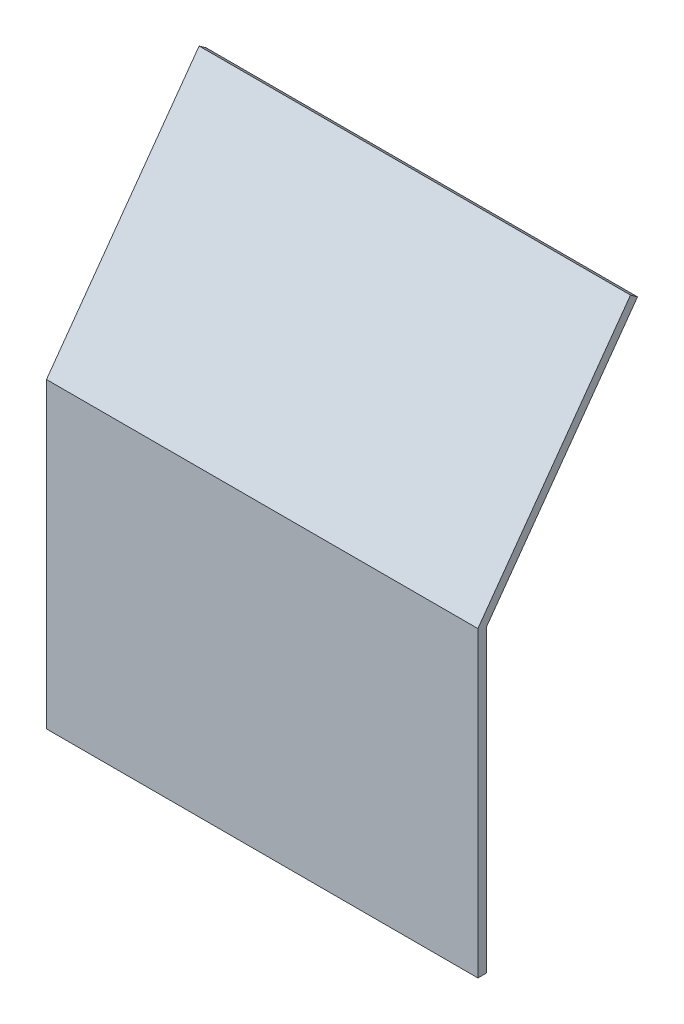
ISO-10303-21;
HEADER;
FILE_DESCRIPTION(('STEP AP214'),'2;1');
FILE_NAME('part.step','',(''),(''),'','','');
FILE_SCHEMA(('AUTOMOTIVE_DESIGN { 1 0 10303 214 1 1 1 1 }'));
ENDSEC;
DATA;
#1=APPLICATION_CONTEXT('core data for automotive mechanical design processes');
#2=APPLICATION_PROTOCOL_DEFINITION('international standard','automotive_design',2000,#1);
#3=PRODUCT_CONTEXT('',#1,'mechanical');
#4=PRODUCT('Part','Part','',(#3));
#5=PRODUCT_RELATED_PRODUCT_CATEGORY('part','',(#4));
#6=PRODUCT_DEFINITION_FORMATION('','',#4);
#7=PRODUCT_DEFINITION_CONTEXT('part definition',#1,'design');
#8=PRODUCT_DEFINITION('design','',#6,#7);
#9=PRODUCT_DEFINITION_SHAPE('','',#8);
#10=(LENGTH_UNIT() NAMED_UNIT(*) SI_UNIT(.MILLI.,.METRE.));
#11=(NAMED_UNIT(*) PLANE_ANGLE_UNIT() SI_UNIT($,.RADIAN.));
#12=(NAMED_UNIT(*) SI_UNIT($,.STERADIAN.) SOLID_ANGLE_UNIT());
#13=UNCERTAINTY_MEASURE_WITH_UNIT(LENGTH_MEASURE(1.E-05),#10,'distance_accuracy_value','');
#14=(GEOMETRIC_REPRESENTATION_CONTEXT(3) GLOBAL_UNCERTAINTY_ASSIGNED_CONTEXT((#13)) GLOBAL_UNIT_ASSIGNED_CONTEXT((#10,
#11,#12)) REPRESENTATION_CONTEXT('',''));
#15=CARTESIAN_POINT('',(0.,0.,0.));
#16=DIRECTION('',(0.,0.,1.));
#17=DIRECTION('',(1.,0.,0.));
#18=AXIS2_PLACEMENT_3D('',#15,#16,#17);
#19=CARTESIAN_POINT('',(100.,0.,0.));
#20=DIRECTION('',(0.,1.,0.));
#21=DIRECTION('',(0.,0.,1.));
#22=AXIS2_PLACEMENT_3D('',#19,#20,#21);
#23=PLANE('',#22);
#24=DIRECTION('',(0.,0.,-1.));
#25=VECTOR('',#24,1.);
#26=CARTESIAN_POINT('',(-100.,0.,0.));
#27=LINE('',#26,#25);
#28=CARTESIAN_POINT('',(-100.,0.,4.));
#29=VERTEX_POINT('',#28);
#30=CARTESIAN_POINT('',(-100.,0.,0.));
#31=VERTEX_POINT('',#30);
#32=EDGE_CURVE('E116',#29,#31,#27,.T.);
#33=ORIENTED_EDGE('',*,*,#32,.T.);
#34=DIRECTION('',(-1.,0.,0.));
#35=VECTOR('',#34,1.);
#36=CARTESIAN_POINT('',(100.,0.,0.));
#37=LINE('',#36,#35);
#38=CARTESIAN_POINT('',(100.,0.,0.));
#39=VERTEX_POINT('',#38);
#40=EDGE_CURVE('E11',#39,#31,#37,.T.);
#41=ORIENTED_EDGE('',*,*,#40,.F.);
#42=DIRECTION('',(0.,0.,-1.));
#43=VECTOR('',#42,1.);
#44=CARTESIAN_POINT('',(100.,0.,0.));
#45=LINE('',#44,#43);
#46=CARTESIAN_POINT('',(100.,0.,4.));
#47=VERTEX_POINT('',#46);
#48=EDGE_CURVE('E126',#47,#39,#45,.T.);
#49=ORIENTED_EDGE('',*,*,#48,.F.);
#50=DIRECTION('',(-1.,0.,0.));
#51=VECTOR('',#50,1.);
#52=CARTESIAN_POINT('',(100.,0.,4.));
#53=LINE('',#52,#51);
#54=EDGE_CURVE('E112',#47,#29,#53,.T.);
#55=ORIENTED_EDGE('',*,*,#54,.T.);
#56=EDGE_LOOP('',(#33,#41,#49,#55));
#57=FACE_BOUND('',#56,.T.);
#58=ADVANCED_FACE('F32',(#57),#23,.F.);
#59=CARTESIAN_POINT('',(100.,139.,0.));
#60=DIRECTION('',(0.,0.,1.));
#61=DIRECTION('',(0.,-1.,0.));
#62=AXIS2_PLACEMENT_3D('',#59,#60,#61);
#63=PLANE('',#62);
#64=DIRECTION('',(0.,1.,0.));
#65=VECTOR('',#64,1.);
#66=CARTESIAN_POINT('',(-100.,139.,0.));
#67=LINE('',#66,#65);
#68=CARTESIAN_POINT('',(-100.,139.,0.));
#69=VERTEX_POINT('',#68);
#70=EDGE_CURVE('E119',#31,#69,#67,.T.);
#71=ORIENTED_EDGE('',*,*,#70,.T.);
#72=DIRECTION('',(-1.,0.,0.));
#73=VECTOR('',#72,1.);
#74=CARTESIAN_POINT('',(100.,139.,0.));
#75=LINE('',#74,#73);
#76=CARTESIAN_POINT('',(100.,139.,0.));
#77=VERTEX_POINT('',#76);
#78=EDGE_CURVE('E40',#77,#69,#75,.T.);
#79=ORIENTED_EDGE('',*,*,#78,.F.);
#80=DIRECTION('',(0.,1.,0.));
#81=VECTOR('',#80,1.);
#82=CARTESIAN_POINT('',(100.,139.,0.));
#83=LINE('',#82,#81);
#84=EDGE_CURVE('E85',#39,#77,#83,.T.);
#85=ORIENTED_EDGE('',*,*,#84,.F.);
#86=ORIENTED_EDGE('',*,*,#40,.T.);
#87=EDGE_LOOP('',(#71,#79,#85,#86));
#88=FACE_BOUND('',#87,.T.);
#89=ADVANCED_FACE('F150',(#88),#63,.F.);
#90=CARTESIAN_POINT('',(100.,236.46794344809,-70.));
#91=DIRECTION('',(0.,0.583333333333333,0.812232862067414));
#92=DIRECTION('',(0.,-0.812232862067414,0.583333333333333));
#93=AXIS2_PLACEMENT_3D('',#90,#91,#92);
#94=PLANE('',#93);
#95=DIRECTION('',(0.,0.812232862067414,-0.583333333333334));
#96=VECTOR('',#95,1.);
#97=CARTESIAN_POINT('',(-100.,236.46794344809,-70.));
#98=LINE('',#97,#96);
#99=CARTESIAN_POINT('',(-100.,236.46794344809,-70.));
#100=VERTEX_POINT('',#99);
#101=EDGE_CURVE('E121',#69,#100,#98,.T.);
#102=ORIENTED_EDGE('',*,*,#101,.T.);
#103=DIRECTION('',(-1.,0.,0.));
#104=VECTOR('',#103,1.);
#105=CARTESIAN_POINT('',(100.,236.46794344809,-70.));
#106=LINE('',#105,#104);
#107=CARTESIAN_POINT('',(100.,236.46794344809,-70.));
#108=VERTEX_POINT('',#107);
#109=EDGE_CURVE('E107',#108,#100,#106,.T.);
#110=ORIENTED_EDGE('',*,*,#109,.F.);
#111=DIRECTION('',(0.,0.812232862067414,-0.583333333333334));
#112=VECTOR('',#111,1.);
#113=CARTESIAN_POINT('',(100.,236.46794344809,-70.));
#114=LINE('',#113,#112);
#115=EDGE_CURVE('E98',#77,#108,#114,.T.);
#116=ORIENTED_EDGE('',*,*,#115,.F.);
#117=ORIENTED_EDGE('',*,*,#78,.T.);
#118=EDGE_LOOP('',(#102,#110,#116,#117));
#119=FACE_BOUND('',#118,.T.);
#120=ADVANCED_FACE('F132',(#119),#94,.F.);
#121=CARTESIAN_POINT('',(100.,238.801276781423,-66.7510685517304));
#122=DIRECTION('',(0.,-0.812232862067415,0.583333333333332));
#123=DIRECTION('',(0.,-0.583333333333332,-0.812232862067415));
#124=AXIS2_PLACEMENT_3D('',#121,#122,#123);
#125=PLANE('',#124);
#126=DIRECTION('',(0.,0.583333333333332,0.812232862067415));
#127=VECTOR('',#126,1.);
#128=CARTESIAN_POINT('',(-100.,238.801276781423,-66.7510685517304));
#129=LINE('',#128,#127);
#130=CARTESIAN_POINT('',(-100.,238.801276781423,-66.7510685517304));
#131=VERTEX_POINT('',#130);
#132=EDGE_CURVE('E106',#100,#131,#129,.T.);
#133=ORIENTED_EDGE('',*,*,#132,.T.);
#134=DIRECTION('',(-1.,0.,0.));
#135=VECTOR('',#134,1.);
#136=CARTESIAN_POINT('',(100.,238.801276781423,-66.7510685517304));
#137=LINE('',#136,#135);
#138=CARTESIAN_POINT('',(100.,238.801276781423,-66.7510685517304));
#139=VERTEX_POINT('',#138);
#140=EDGE_CURVE('E103',#139,#131,#137,.T.);
#141=ORIENTED_EDGE('',*,*,#140,.F.);
#142=DIRECTION('',(0.,0.583333333333332,0.812232862067415));
#143=VECTOR('',#142,1.);
#144=CARTESIAN_POINT('',(100.,238.801276781423,-66.7510685517304));
#145=LINE('',#144,#143);
#146=EDGE_CURVE('E92',#108,#139,#145,.T.);
#147=ORIENTED_EDGE('',*,*,#146,.F.);
#148=ORIENTED_EDGE('',*,*,#109,.T.);
#149=EDGE_LOOP('',(#133,#141,#147,#148));
#150=FACE_BOUND('',#149,.T.);
#151=ADVANCED_FACE('F104',(#150),#125,.F.);
#152=CARTESIAN_POINT('',(100.,140.287546088681,3.99999999999999));
#153=DIRECTION('',(0.,-0.583333333333333,-0.812232862067414));
#154=DIRECTION('',(0.,0.812232862067414,-0.583333333333333));
#155=AXIS2_PLACEMENT_3D('',#152,#153,#154);
#156=PLANE('',#155);
#157=DIRECTION('',(0.,-0.812232862067414,0.583333333333333));
#158=VECTOR('',#157,1.);
#159=CARTESIAN_POINT('',(-100.,140.287546088681,3.99999999999999));
#160=LINE('',#159,#158);
#161=CARTESIAN_POINT('',(-100.,140.287546088681,3.99999999999999));
#162=VERTEX_POINT('',#161);
#163=EDGE_CURVE('E71',#131,#162,#160,.T.);
#164=ORIENTED_EDGE('',*,*,#163,.T.);
#165=DIRECTION('',(-1.,0.,0.));
#166=VECTOR('',#165,1.);
#167=CARTESIAN_POINT('',(100.,140.287546088681,3.99999999999999));
#168=LINE('',#167,#166);
#169=CARTESIAN_POINT('',(100.,140.287546088681,3.99999999999999));
#170=VERTEX_POINT('',#169);
#171=EDGE_CURVE('E108',#170,#162,#168,.T.);
#172=ORIENTED_EDGE('',*,*,#171,.F.);
#173=DIRECTION('',(0.,-0.812232862067414,0.583333333333333));
#174=VECTOR('',#173,1.);
#175=CARTESIAN_POINT('',(100.,140.287546088681,3.99999999999999));
#176=LINE('',#175,#174);
#177=EDGE_CURVE('E96',#139,#170,#176,.T.);
#178=ORIENTED_EDGE('',*,*,#177,.F.);
#179=ORIENTED_EDGE('',*,*,#140,.T.);
#180=EDGE_LOOP('',(#164,#172,#178,#179));
#181=FACE_BOUND('',#180,.T.);
#182=ADVANCED_FACE('F110',(#181),#156,.F.);
#183=CARTESIAN_POINT('',(100.,0.,4.));
#184=DIRECTION('',(0.,0.,-1.));
#185=DIRECTION('',(0.,1.,0.));
#186=AXIS2_PLACEMENT_3D('',#183,#184,#185);
#187=PLANE('',#186);
#188=DIRECTION('',(0.,-1.,0.));
#189=VECTOR('',#188,1.);
#190=CARTESIAN_POINT('',(-100.,0.,4.));
#191=LINE('',#190,#189);
#192=EDGE_CURVE('E77',#162,#29,#191,.T.);
#193=ORIENTED_EDGE('',*,*,#192,.T.);
#194=ORIENTED_EDGE('',*,*,#54,.F.);
#195=DIRECTION('',(0.,-1.,0.));
#196=VECTOR('',#195,1.);
#197=CARTESIAN_POINT('',(100.,0.,4.));
#198=LINE('',#197,#196);
#199=EDGE_CURVE('E48',#170,#47,#198,.T.);
#200=ORIENTED_EDGE('',*,*,#199,.F.);
#201=ORIENTED_EDGE('',*,*,#171,.T.);
#202=EDGE_LOOP('',(#193,#194,#200,#201));
#203=FACE_BOUND('',#202,.T.);
#204=ADVANCED_FACE('F139',(#203),#187,.F.);
#205=CARTESIAN_POINT('',(100.,0.,0.));
#206=DIRECTION('',(-1.,0.,0.));
#207=DIRECTION('',(0.,0.,1.));
#208=AXIS2_PLACEMENT_3D('',#205,#206,#207);
#209=PLANE('',#208);
#210=ORIENTED_EDGE('',*,*,#48,.T.);
#211=ORIENTED_EDGE('',*,*,#84,.T.);
#212=ORIENTED_EDGE('',*,*,#115,.T.);
#213=ORIENTED_EDGE('',*,*,#146,.T.);
#214=ORIENTED_EDGE('',*,*,#177,.T.);
#215=ORIENTED_EDGE('',*,*,#199,.T.);
#216=EDGE_LOOP('',(#210,#211,#212,#213,#214,#215));
#217=FACE_BOUND('',#216,.T.);
#218=ADVANCED_FACE('F94',(#217),#209,.F.);
#219=CARTESIAN_POINT('',(-100.,0.,0.));
#220=DIRECTION('',(-1.,0.,0.));
#221=DIRECTION('',(0.,0.,1.));
#222=AXIS2_PLACEMENT_3D('',#219,#220,#221);
#223=PLANE('',#222);
#224=ORIENTED_EDGE('',*,*,#32,.F.);
#225=ORIENTED_EDGE('',*,*,#192,.F.);
#226=ORIENTED_EDGE('',*,*,#163,.F.);
#227=ORIENTED_EDGE('',*,*,#132,.F.);
#228=ORIENTED_EDGE('',*,*,#101,.F.);
#229=ORIENTED_EDGE('',*,*,#70,.F.);
#230=EDGE_LOOP('',(#224,#225,#226,#227,#228,#229));
#231=FACE_BOUND('',#230,.T.);
#232=ADVANCED_FACE('F135',(#231),#223,.T.);
#233=CLOSED_SHELL('',(#58,#89,#120,#151,#182,#204,#218,#232));
#234=MANIFOLD_SOLID_BREP('B2',#233);
#235=ADVANCED_BREP_SHAPE_REPRESENTATION('',(#18,#234),#14);
#236=SHAPE_DEFINITION_REPRESENTATION(#9,#235);
ENDSEC;
END-ISO-10303-21;
